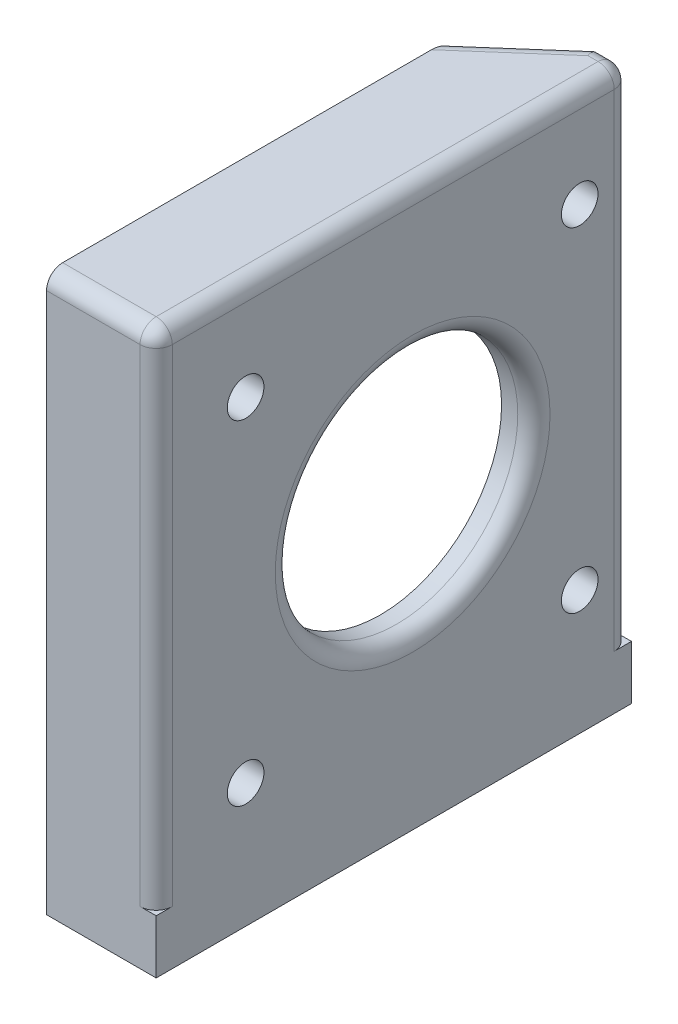
ISO-10303-21;
HEADER;
FILE_DESCRIPTION(('STEP AP214'),'2;1');
FILE_NAME('part.step','',(''),(''),'','','');
FILE_SCHEMA(('AUTOMOTIVE_DESIGN { 1 0 10303 214 1 1 1 1 }'));
ENDSEC;
DATA;
#1=APPLICATION_CONTEXT('core data for automotive mechanical design processes');
#2=APPLICATION_PROTOCOL_DEFINITION('international standard','automotive_design',2000,#1);
#3=PRODUCT_CONTEXT('',#1,'mechanical');
#4=PRODUCT('Part','Part','',(#3));
#5=PRODUCT_RELATED_PRODUCT_CATEGORY('part','',(#4));
#6=PRODUCT_DEFINITION_FORMATION('','',#4);
#7=PRODUCT_DEFINITION_CONTEXT('part definition',#1,'design');
#8=PRODUCT_DEFINITION('design','',#6,#7);
#9=PRODUCT_DEFINITION_SHAPE('','',#8);
#10=(LENGTH_UNIT() NAMED_UNIT(*) SI_UNIT(.MILLI.,.METRE.));
#11=(NAMED_UNIT(*) PLANE_ANGLE_UNIT() SI_UNIT($,.RADIAN.));
#12=(NAMED_UNIT(*) SI_UNIT($,.STERADIAN.) SOLID_ANGLE_UNIT());
#13=UNCERTAINTY_MEASURE_WITH_UNIT(LENGTH_MEASURE(1.E-05),#10,'distance_accuracy_value','');
#14=(GEOMETRIC_REPRESENTATION_CONTEXT(3) GLOBAL_UNCERTAINTY_ASSIGNED_CONTEXT((#13)) GLOBAL_UNIT_ASSIGNED_CONTEXT((#10,
#11,#12)) REPRESENTATION_CONTEXT('',''));
#15=CARTESIAN_POINT('',(0.,0.,0.));
#16=DIRECTION('',(0.,0.,1.));
#17=DIRECTION('',(1.,0.,0.));
#18=AXIS2_PLACEMENT_3D('',#15,#16,#17);
#19=CARTESIAN_POINT('',(0.,5.,0.));
#20=DIRECTION('',(0.,1.,0.));
#21=DIRECTION('',(0.,0.,1.));
#22=AXIS2_PLACEMENT_3D('',#19,#20,#21);
#23=PLANE('',#22);
#24=DIRECTION('',(-1.,0.,0.));
#25=VECTOR('',#24,1.);
#26=CARTESIAN_POINT('',(0.,5.,266.464902660625));
#27=LINE('',#26,#25);
#28=CARTESIAN_POINT('',(104.746286717569,5.,266.464902660625));
#29=VERTEX_POINT('',#28);
#30=CARTESIAN_POINT('',(103.249286717569,5.,266.464902660625));
#31=VERTEX_POINT('',#30);
#32=EDGE_CURVE('E533',#29,#31,#27,.T.);
#33=ORIENTED_EDGE('',*,*,#32,.F.);
#34=DIRECTION('',(0.,0.,-1.));
#35=VECTOR('',#34,1.);
#36=CARTESIAN_POINT('',(104.746286717569,5.,0.));
#37=LINE('',#36,#35);
#38=CARTESIAN_POINT('',(104.746286717569,5.,264.967902660625));
#39=VERTEX_POINT('',#38);
#40=EDGE_CURVE('E706',#29,#39,#37,.T.);
#41=ORIENTED_EDGE('',*,*,#40,.T.);
#42=CARTESIAN_POINT('',(103.249286717569,5.,264.967902660625));
#43=DIRECTION('',(0.,1.,0.));
#44=DIRECTION('',(0.,0.,1.));
#45=AXIS2_PLACEMENT_3D('',#42,#43,#44);
#46=CIRCLE('',#45,1.497);
#47=EDGE_CURVE('E574',#39,#31,#46,.F.);
#48=ORIENTED_EDGE('',*,*,#47,.T.);
#49=EDGE_LOOP('',(#33,#41,#48));
#50=FACE_BOUND('',#49,.T.);
#51=ADVANCED_FACE('F403',(#50),#23,.T.);
#52=DIRECTION('',(-1.,0.,0.));
#53=VECTOR('',#52,1.);
#54=CARTESIAN_POINT('',(0.,5.,222.360700602375));
#55=LINE('',#54,#53);
#56=CARTESIAN_POINT('',(104.746286717569,5.,222.360700602375));
#57=VERTEX_POINT('',#56);
#58=CARTESIAN_POINT('',(94.5719030393506,5.,222.360700602375));
#59=VERTEX_POINT('',#58);
#60=EDGE_CURVE('E582',#57,#59,#55,.T.);
#61=ORIENTED_EDGE('',*,*,#60,.T.);
#62=DIRECTION('',(0.,0.,1.));
#63=VECTOR('',#62,1.);
#64=CARTESIAN_POINT('',(94.5719030393506,5.,0.));
#65=LINE('',#64,#63);
#66=CARTESIAN_POINT('',(94.5719030393506,5.,263.664902660625));
#67=VERTEX_POINT('',#66);
#68=EDGE_CURVE('E658',#59,#67,#65,.T.);
#69=ORIENTED_EDGE('',*,*,#68,.T.);
#70=DIRECTION('',(-1.,0.,0.));
#71=VECTOR('',#70,1.);
#72=CARTESIAN_POINT('',(101.746286717569,5.,263.664902660625));
#73=LINE('',#72,#71);
#74=CARTESIAN_POINT('',(101.746286717569,5.,263.664902660625));
#75=VERTEX_POINT('',#74);
#76=EDGE_CURVE('E539',#75,#67,#73,.T.);
#77=ORIENTED_EDGE('',*,*,#76,.F.);
#78=DIRECTION('',(0.,0.,1.));
#79=VECTOR('',#78,1.);
#80=CARTESIAN_POINT('',(101.746286717569,5.,222.264902660625));
#81=LINE('',#80,#79);
#82=CARTESIAN_POINT('',(101.746286717569,5.00000000000002,222.464902660625));
#83=VERTEX_POINT('',#82);
#84=EDGE_CURVE('E639',#83,#75,#81,.T.);
#85=ORIENTED_EDGE('',*,*,#84,.F.);
#86=DIRECTION('',(1.,0.,0.));
#87=VECTOR('',#86,1.);
#88=CARTESIAN_POINT('',(101.746286717569,5.00000000000002,222.464902660625));
#89=LINE('',#88,#87);
#90=CARTESIAN_POINT('',(103.249286717569,5.00000000000002,222.464902660625));
#91=VERTEX_POINT('',#90);
#92=EDGE_CURVE('E626',#83,#91,#89,.T.);
#93=ORIENTED_EDGE('',*,*,#92,.T.);
#94=CARTESIAN_POINT('',(103.249286717569,5.,223.961902660625));
#95=DIRECTION('',(0.,1.,0.));
#96=DIRECTION('',(0.,0.,1.));
#97=AXIS2_PLACEMENT_3D('',#94,#95,#96);
#98=CIRCLE('',#97,1.497);
#99=CARTESIAN_POINT('',(104.746286717569,5.00000000000001,223.961902660625));
#100=VERTEX_POINT('',#99);
#101=EDGE_CURVE('E411',#91,#100,#98,.F.);
#102=ORIENTED_EDGE('',*,*,#101,.T.);
#103=EDGE_CURVE('E704',#100,#57,#37,.T.);
#104=ORIENTED_EDGE('',*,*,#103,.T.);
#105=EDGE_LOOP('',(#61,#69,#77,#85,#93,#102,#104));
#106=FACE_BOUND('',#105,.T.);
#107=ADVANCED_FACE('F657',(#106),#23,.T.);
#108=CARTESIAN_POINT('',(0.,5.,266.464902660625));
#109=DIRECTION('',(0.,0.,1.));
#110=DIRECTION('',(1.,0.,0.));
#111=AXIS2_PLACEMENT_3D('',#108,#109,#110);
#112=PLANE('',#111);
#113=DIRECTION('',(-1.,0.,0.));
#114=VECTOR('',#113,1.);
#115=CARTESIAN_POINT('',(0.,50.153,266.464902660625));
#116=LINE('',#115,#114);
#117=CARTESIAN_POINT('',(103.249286717569,50.153,266.464902660625));
#118=VERTEX_POINT('',#117);
#119=CARTESIAN_POINT('',(94.5719030393506,50.153,266.464902660625));
#120=VERTEX_POINT('',#119);
#121=EDGE_CURVE('E526',#118,#120,#116,.T.);
#122=ORIENTED_EDGE('',*,*,#121,.T.);
#123=DIRECTION('',(0.,1.,0.));
#124=VECTOR('',#123,1.);
#125=CARTESIAN_POINT('',(94.5719030393506,0.,266.464902660625));
#126=LINE('',#125,#124);
#127=CARTESIAN_POINT('',(94.5719030393506,0.,266.464902660625));
#128=VERTEX_POINT('',#127);
#129=EDGE_CURVE('E418',#128,#120,#126,.T.);
#130=ORIENTED_EDGE('',*,*,#129,.F.);
#131=DIRECTION('',(-1.,0.,0.));
#132=VECTOR('',#131,1.);
#133=CARTESIAN_POINT('',(0.,0.,266.464902660625));
#134=LINE('',#133,#132);
#135=CARTESIAN_POINT('',(104.746286717569,0.,266.464902660625));
#136=VERTEX_POINT('',#135);
#137=EDGE_CURVE('E524',#136,#128,#134,.T.);
#138=ORIENTED_EDGE('',*,*,#137,.F.);
#139=DIRECTION('',(0.,1.,0.));
#140=VECTOR('',#139,1.);
#141=CARTESIAN_POINT('',(104.746286717569,0.,266.464902660625));
#142=LINE('',#141,#140);
#143=EDGE_CURVE('E527',#136,#29,#142,.T.);
#144=ORIENTED_EDGE('',*,*,#143,.T.);
#145=ORIENTED_EDGE('',*,*,#32,.T.);
#146=DIRECTION('',(0.,1.,0.));
#147=VECTOR('',#146,1.);
#148=CARTESIAN_POINT('',(103.249286717569,5.,266.464902660625));
#149=LINE('',#148,#147);
#150=EDGE_CURVE('E563',#31,#118,#149,.T.);
#151=ORIENTED_EDGE('',*,*,#150,.T.);
#152=EDGE_LOOP('',(#122,#130,#138,#144,#145,#151));
#153=FACE_BOUND('',#152,.T.);
#154=ADVANCED_FACE('F522',(#153),#112,.T.);
#155=CARTESIAN_POINT('',(0.,0.,0.));
#156=DIRECTION('',(0.,1.,0.));
#157=DIRECTION('',(0.,0.,1.));
#158=AXIS2_PLACEMENT_3D('',#155,#156,#157);
#159=PLANE('',#158);
#160=DIRECTION('',(0.,0.,1.));
#161=VECTOR('',#160,1.);
#162=CARTESIAN_POINT('',(94.5719030393506,0.,266.464902660625));
#163=LINE('',#162,#161);
#164=CARTESIAN_POINT('',(94.5719030393506,0.,222.360700602375));
#165=VERTEX_POINT('',#164);
#166=EDGE_CURVE('E508',#165,#128,#163,.T.);
#167=ORIENTED_EDGE('',*,*,#166,.F.);
#168=DIRECTION('',(-1.,0.,0.));
#169=VECTOR('',#168,1.);
#170=CARTESIAN_POINT('',(94.5719030393506,0.,222.360700602375));
#171=LINE('',#170,#169);
#172=CARTESIAN_POINT('',(104.746286717569,0.,222.360700602375));
#173=VERTEX_POINT('',#172);
#174=EDGE_CURVE('E528',#173,#165,#171,.T.);
#175=ORIENTED_EDGE('',*,*,#174,.F.);
#176=DIRECTION('',(0.,0.,-1.));
#177=VECTOR('',#176,1.);
#178=CARTESIAN_POINT('',(104.746286717569,0.,266.464902660625));
#179=LINE('',#178,#177);
#180=EDGE_CURVE('E516',#136,#173,#179,.T.);
#181=ORIENTED_EDGE('',*,*,#180,.F.);
#182=ORIENTED_EDGE('',*,*,#137,.T.);
#183=EDGE_LOOP('',(#167,#175,#181,#182));
#184=FACE_BOUND('',#183,.T.);
#185=ADVANCED_FACE('F531',(#184),#159,.F.);
#186=CARTESIAN_POINT('',(104.746286717569,51.65,219.464902660625));
#187=DIRECTION('',(0.,1.,0.));
#188=DIRECTION('',(-1.,0.,0.));
#189=AXIS2_PLACEMENT_3D('',#186,#187,#188);
#190=PLANE('',#189);
#191=DIRECTION('',(0.751981712027143,0.,-0.659183968840814));
#192=VECTOR('',#191,1.);
#193=CARTESIAN_POINT('',(55.7330851189234,51.65,264.790619283529));
#194=LINE('',#193,#192);
#195=CARTESIAN_POINT('',(102.309533693596,51.65,223.961902660625));
#196=VERTEX_POINT('',#195);
#197=CARTESIAN_POINT('',(94.5719030393506,51.65,230.744676766049));
#198=VERTEX_POINT('',#197);
#199=EDGE_CURVE('E555',#196,#198,#194,.F.);
#200=ORIENTED_EDGE('',*,*,#199,.T.);
#201=DIRECTION('',(0.,0.,1.));
#202=VECTOR('',#201,1.);
#203=CARTESIAN_POINT('',(94.5719030393506,51.65,266.464902660625));
#204=LINE('',#203,#202);
#205=CARTESIAN_POINT('',(94.5719030393506,51.65,264.967902660625));
#206=VERTEX_POINT('',#205);
#207=EDGE_CURVE('E517',#198,#206,#204,.T.);
#208=ORIENTED_EDGE('',*,*,#207,.T.);
#209=DIRECTION('',(-1.,0.,0.));
#210=VECTOR('',#209,1.);
#211=CARTESIAN_POINT('',(104.746286717569,51.65,264.967902660625));
#212=LINE('',#211,#210);
#213=CARTESIAN_POINT('',(103.249286717569,51.65,264.967902660625));
#214=VERTEX_POINT('',#213);
#215=EDGE_CURVE('E558',#206,#214,#212,.F.);
#216=ORIENTED_EDGE('',*,*,#215,.T.);
#217=DIRECTION('',(0.,0.,1.));
#218=VECTOR('',#217,1.);
#219=CARTESIAN_POINT('',(103.249286717569,51.65,219.464902660625));
#220=LINE('',#219,#218);
#221=CARTESIAN_POINT('',(103.249286717569,51.65,223.961902660625));
#222=VERTEX_POINT('',#221);
#223=EDGE_CURVE('E560',#214,#222,#220,.F.);
#224=ORIENTED_EDGE('',*,*,#223,.T.);
#225=DIRECTION('',(1.,0.,0.));
#226=VECTOR('',#225,1.);
#227=CARTESIAN_POINT('',(101.746286717569,51.65,223.961902660625));
#228=LINE('',#227,#226);
#229=EDGE_CURVE('E553',#222,#196,#228,.F.);
#230=ORIENTED_EDGE('',*,*,#229,.T.);
#231=EDGE_LOOP('',(#200,#208,#216,#224,#230));
#232=FACE_BOUND('',#231,.T.);
#233=ADVANCED_FACE('F719',(#232),#190,.T.);
#234=CARTESIAN_POINT('',(101.746286717569,49.05,222.264902660625));
#235=DIRECTION('',(0.,-1.,0.));
#236=DIRECTION('',(0.,0.,-1.));
#237=AXIS2_PLACEMENT_3D('',#234,#235,#236);
#238=PLANE('',#237);
#239=DIRECTION('',(-1.,0.,0.));
#240=VECTOR('',#239,1.);
#241=CARTESIAN_POINT('',(101.746286717569,49.05,263.664902660625));
#242=LINE('',#241,#240);
#243=CARTESIAN_POINT('',(101.746286717569,49.05,263.664902660625));
#244=VERTEX_POINT('',#243);
#245=CARTESIAN_POINT('',(94.5719030393506,49.05,263.664902660625));
#246=VERTEX_POINT('',#245);
#247=EDGE_CURVE('E534',#244,#246,#242,.T.);
#248=ORIENTED_EDGE('',*,*,#247,.T.);
#249=DIRECTION('',(0.,0.,-1.));
#250=VECTOR('',#249,1.);
#251=CARTESIAN_POINT('',(94.5719030393506,49.05,222.264902660625));
#252=LINE('',#251,#250);
#253=CARTESIAN_POINT('',(94.5719030393506,49.05,228.753936863659));
#254=VERTEX_POINT('',#253);
#255=EDGE_CURVE('E662',#246,#254,#252,.T.);
#256=ORIENTED_EDGE('',*,*,#255,.T.);
#257=DIRECTION('',(-0.751981712027143,0.,0.659183968840814));
#258=VECTOR('',#257,1.);
#259=CARTESIAN_POINT('',(101.845425575455,49.05,222.37799795967));
#260=LINE('',#259,#258);
#261=CARTESIAN_POINT('',(101.746286717569,49.05,222.464902660625));
#262=VERTEX_POINT('',#261);
#263=EDGE_CURVE('E633',#262,#254,#260,.T.);
#264=ORIENTED_EDGE('',*,*,#263,.F.);
#265=DIRECTION('',(0.,0.,1.));
#266=VECTOR('',#265,1.);
#267=CARTESIAN_POINT('',(101.746286717569,49.05,222.264902660625));
#268=LINE('',#267,#266);
#269=EDGE_CURVE('E644',#262,#244,#268,.T.);
#270=ORIENTED_EDGE('',*,*,#269,.T.);
#271=EDGE_LOOP('',(#248,#256,#264,#270));
#272=FACE_BOUND('',#271,.T.);
#273=ADVANCED_FACE('F685',(#272),#238,.T.);
#274=CARTESIAN_POINT('',(101.746286717569,49.05,263.664902660625));
#275=DIRECTION('',(0.,0.,-1.));
#276=DIRECTION('',(-1.,0.,0.));
#277=AXIS2_PLACEMENT_3D('',#274,#275,#276);
#278=PLANE('',#277);
#279=ORIENTED_EDGE('',*,*,#76,.T.);
#280=DIRECTION('',(0.,1.,0.));
#281=VECTOR('',#280,1.);
#282=CARTESIAN_POINT('',(94.5719030393506,49.05,263.664902660625));
#283=LINE('',#282,#281);
#284=EDGE_CURVE('E651',#67,#246,#283,.T.);
#285=ORIENTED_EDGE('',*,*,#284,.T.);
#286=ORIENTED_EDGE('',*,*,#247,.F.);
#287=DIRECTION('',(0.,-1.,0.));
#288=VECTOR('',#287,1.);
#289=CARTESIAN_POINT('',(101.746286717569,49.05,263.664902660625));
#290=LINE('',#289,#288);
#291=EDGE_CURVE('E641',#244,#75,#290,.T.);
#292=ORIENTED_EDGE('',*,*,#291,.T.);
#293=EDGE_LOOP('',(#279,#285,#286,#292));
#294=FACE_BOUND('',#293,.T.);
#295=ADVANCED_FACE('F649',(#294),#278,.T.);
#296=CARTESIAN_POINT('',(54.7462867175687,5.,263.664902660625));
#297=DIRECTION('',(0.659183968840814,0.,0.751981712027143));
#298=DIRECTION('',(0.751981712027143,0.,-0.659183968840814));
#299=AXIS2_PLACEMENT_3D('',#296,#297,#298);
#300=PLANE('',#299);
#301=DIRECTION('',(0.,-1.,0.));
#302=VECTOR('',#301,1.);
#303=CARTESIAN_POINT('',(94.5719030393506,5.,228.753936863659));
#304=LINE('',#303,#302);
#305=CARTESIAN_POINT('',(94.5719030393506,50.153,228.753936863659));
#306=VERTEX_POINT('',#305);
#307=EDGE_CURVE('E690',#306,#254,#304,.T.);
#308=ORIENTED_EDGE('',*,*,#307,.F.);
#309=DIRECTION('',(0.751981712027143,0.,-0.659183968840814));
#310=VECTOR('',#309,1.);
#311=CARTESIAN_POINT('',(101.746286717569,50.153,222.464902660625));
#312=LINE('',#311,#310);
#313=CARTESIAN_POINT('',(101.746286717569,50.153,222.464902660625));
#314=VERTEX_POINT('',#313);
#315=EDGE_CURVE('E566',#306,#314,#312,.T.);
#316=ORIENTED_EDGE('',*,*,#315,.T.);
#317=DIRECTION('',(0.,1.,0.));
#318=VECTOR('',#317,1.);
#319=CARTESIAN_POINT('',(101.746286717569,5.00000000000002,222.464902660625));
#320=LINE('',#319,#318);
#321=EDGE_CURVE('E629',#262,#314,#320,.T.);
#322=ORIENTED_EDGE('',*,*,#321,.F.);
#323=ORIENTED_EDGE('',*,*,#263,.T.);
#324=EDGE_LOOP('',(#308,#316,#322,#323));
#325=FACE_BOUND('',#324,.T.);
#326=ADVANCED_FACE('F689',(#325),#300,.F.);
#327=CARTESIAN_POINT('',(55.7330851189234,50.153,264.790619283529));
#328=DIRECTION('',(-0.751981712027143,0.,0.659183968840814));
#329=DIRECTION('',(0.659183968840814,0.,0.751981712027143));
#330=AXIS2_PLACEMENT_3D('',#327,#328,#329);
#331=CYLINDRICAL_SURFACE('',#330,1.497);
#332=ORIENTED_EDGE('',*,*,#315,.F.);
#333=CARTESIAN_POINT('',(94.5719030393506,50.153,230.744676766049));
#334=DIRECTION('',(-1.,0.,0.));
#335=DIRECTION('',(0.,0.,1.));
#336=AXIS2_PLACEMENT_3D('',#333,#334,#335);
#337=ELLIPSE('',#336,1.99073990239003,1.497);
#338=EDGE_CURVE('E708',#306,#198,#337,.F.);
#339=ORIENTED_EDGE('',*,*,#338,.T.);
#340=ORIENTED_EDGE('',*,*,#199,.F.);
#341=CARTESIAN_POINT('',(102.309533693596,50.153,223.961902660625));
#342=DIRECTION('',(-0.935943831655282,0.,0.352149320582091));
#343=DIRECTION('',(-0.352149320582091,0.,-0.935943831655282));
#344=AXIS2_PLACEMENT_3D('',#341,#342,#343);
#345=ELLIPSE('',#344,1.59945495591594,1.497);
#346=EDGE_CURVE('E595',#314,#196,#345,.F.);
#347=ORIENTED_EDGE('',*,*,#346,.F.);
#348=EDGE_LOOP('',(#332,#339,#340,#347));
#349=FACE_BOUND('',#348,.T.);
#350=ADVANCED_FACE('F717',(#349),#331,.T.);
#351=CARTESIAN_POINT('',(0.,50.153,264.967902660625));
#352=DIRECTION('',(-1.,0.,0.));
#353=DIRECTION('',(0.,-1.,0.));
#354=AXIS2_PLACEMENT_3D('',#351,#352,#353);
#355=CYLINDRICAL_SURFACE('',#354,1.497);
#356=ORIENTED_EDGE('',*,*,#215,.F.);
#357=CARTESIAN_POINT('',(94.5719030393506,50.153,264.967902660625));
#358=DIRECTION('',(-1.,0.,0.));
#359=DIRECTION('',(0.,-1.,0.));
#360=AXIS2_PLACEMENT_3D('',#357,#358,#359);
#361=CIRCLE('',#360,1.497);
#362=EDGE_CURVE('E13',#206,#120,#361,.F.);
#363=ORIENTED_EDGE('',*,*,#362,.T.);
#364=ORIENTED_EDGE('',*,*,#121,.F.);
#365=CARTESIAN_POINT('',(103.249286717569,50.153,264.967902660625));
#366=DIRECTION('',(1.,0.,0.));
#367=DIRECTION('',(0.,0.,-1.));
#368=AXIS2_PLACEMENT_3D('',#365,#366,#367);
#369=CIRCLE('',#368,1.497);
#370=EDGE_CURVE('E584',#214,#118,#369,.T.);
#371=ORIENTED_EDGE('',*,*,#370,.F.);
#372=EDGE_LOOP('',(#356,#363,#364,#371));
#373=FACE_BOUND('',#372,.T.);
#374=ADVANCED_FACE('F740',(#373),#355,.T.);
#375=CARTESIAN_POINT('',(104.746286717569,5.,219.464902660625));
#376=DIRECTION('',(1.,0.,0.));
#377=DIRECTION('',(0.,0.,-1.));
#378=AXIS2_PLACEMENT_3D('',#375,#376,#377);
#379=PLANE('',#378);
#380=DIRECTION('',(0.,1.,0.));
#381=VECTOR('',#380,1.);
#382=CARTESIAN_POINT('',(104.746286717569,5.,264.967902660625));
#383=LINE('',#382,#381);
#384=CARTESIAN_POINT('',(104.746286717569,50.153,264.967902660625));
#385=VERTEX_POINT('',#384);
#386=EDGE_CURVE('E547',#385,#39,#383,.F.);
#387=ORIENTED_EDGE('',*,*,#386,.T.);
#388=ORIENTED_EDGE('',*,*,#40,.F.);
#389=ORIENTED_EDGE('',*,*,#143,.F.);
#390=ORIENTED_EDGE('',*,*,#180,.T.);
#391=DIRECTION('',(0.,1.,0.));
#392=VECTOR('',#391,1.);
#393=CARTESIAN_POINT('',(104.746286717569,0.,222.360700602375));
#394=LINE('',#393,#392);
#395=EDGE_CURVE('E705',#173,#57,#394,.T.);
#396=ORIENTED_EDGE('',*,*,#395,.T.);
#397=ORIENTED_EDGE('',*,*,#103,.F.);
#398=DIRECTION('',(0.,1.,0.));
#399=VECTOR('',#398,1.);
#400=CARTESIAN_POINT('',(104.746286717569,51.65,223.961902660625));
#401=LINE('',#400,#399);
#402=CARTESIAN_POINT('',(104.746286717569,50.153,223.961902660625));
#403=VERTEX_POINT('',#402);
#404=EDGE_CURVE('E536',#100,#403,#401,.T.);
#405=ORIENTED_EDGE('',*,*,#404,.T.);
#406=DIRECTION('',(0.,0.,1.));
#407=VECTOR('',#406,1.);
#408=CARTESIAN_POINT('',(104.746286717569,50.153,219.464902660625));
#409=LINE('',#408,#407);
#410=EDGE_CURVE('E544',#403,#385,#409,.T.);
#411=ORIENTED_EDGE('',*,*,#410,.T.);
#412=EDGE_LOOP('',(#387,#388,#389,#390,#396,#397,#405,#411));
#413=FACE_BOUND('',#412,.T.);
#414=CARTESIAN_POINT('',(104.746286717569,27.025,242.664902660625));
#415=DIRECTION('',(1.,0.,0.));
#416=DIRECTION('',(0.,0.,-1.));
#417=AXIS2_PLACEMENT_3D('',#414,#415,#416);
#418=CIRCLE('',#417,12.747);
#419=CARTESIAN_POINT('',(104.746286717569,27.025,229.917902660625));
#420=VERTEX_POINT('',#419);
#421=EDGE_CURVE('E550',#420,#420,#418,.F.);
#422=ORIENTED_EDGE('',*,*,#421,.T.);
#423=EDGE_LOOP('',(#422));
#424=FACE_BOUND('',#423,.T.);
#425=CARTESIAN_POINT('',(104.746286717569,11.525,227.164902660625));
#426=DIRECTION('',(1.,0.,0.));
#427=DIRECTION('',(0.,0.,-1.));
#428=AXIS2_PLACEMENT_3D('',#425,#426,#427);
#429=CIRCLE('',#428,1.70000000000001);
#430=CARTESIAN_POINT('',(104.746286717569,11.525,225.464902660625));
#431=VERTEX_POINT('',#430);
#432=EDGE_CURVE('E623',#431,#431,#429,.T.);
#433=ORIENTED_EDGE('',*,*,#432,.F.);
#434=EDGE_LOOP('',(#433));
#435=FACE_BOUND('',#434,.T.);
#436=CARTESIAN_POINT('',(104.746286717569,11.525,258.164902660625));
#437=DIRECTION('',(1.,0.,0.));
#438=DIRECTION('',(0.,0.,-1.));
#439=AXIS2_PLACEMENT_3D('',#436,#437,#438);
#440=CIRCLE('',#439,1.69999999999996);
#441=CARTESIAN_POINT('',(104.746286717569,11.525,256.464902660625));
#442=VERTEX_POINT('',#441);
#443=EDGE_CURVE('E620',#442,#442,#440,.T.);
#444=ORIENTED_EDGE('',*,*,#443,.F.);
#445=EDGE_LOOP('',(#444));
#446=FACE_BOUND('',#445,.T.);
#447=CARTESIAN_POINT('',(104.746286717569,42.525,258.164902660625));
#448=DIRECTION('',(1.,0.,0.));
#449=DIRECTION('',(0.,0.,-1.));
#450=AXIS2_PLACEMENT_3D('',#447,#448,#449);
#451=CIRCLE('',#450,1.69999999999996);
#452=CARTESIAN_POINT('',(104.746286717569,42.525,256.464902660625));
#453=VERTEX_POINT('',#452);
#454=EDGE_CURVE('E617',#453,#453,#451,.T.);
#455=ORIENTED_EDGE('',*,*,#454,.F.);
#456=EDGE_LOOP('',(#455));
#457=FACE_BOUND('',#456,.T.);
#458=CARTESIAN_POINT('',(104.746286717569,42.525,227.164902660625));
#459=DIRECTION('',(1.,0.,0.));
#460=DIRECTION('',(0.,0.,-1.));
#461=AXIS2_PLACEMENT_3D('',#458,#459,#460);
#462=CIRCLE('',#461,1.70000000000001);
#463=CARTESIAN_POINT('',(104.746286717569,42.525,225.464902660625));
#464=VERTEX_POINT('',#463);
#465=EDGE_CURVE('E614',#464,#464,#462,.T.);
#466=ORIENTED_EDGE('',*,*,#465,.F.);
#467=EDGE_LOOP('',(#466));
#468=FACE_BOUND('',#467,.T.);
#469=ADVANCED_FACE('F674',(#413,#424,#435,#446,#457,#468),#379,.T.);
#470=CARTESIAN_POINT('',(101.746286717569,0.,0.));
#471=DIRECTION('',(1.,0.,0.));
#472=DIRECTION('',(0.,0.,-1.));
#473=AXIS2_PLACEMENT_3D('',#470,#471,#472);
#474=PLANE('',#473);
#475=CARTESIAN_POINT('',(101.746286717569,11.525,227.164902660625));
#476=DIRECTION('',(-1.,0.,0.));
#477=DIRECTION('',(0.,0.,1.));
#478=AXIS2_PLACEMENT_3D('',#475,#476,#477);
#479=CIRCLE('',#478,1.70000000000001);
#480=CARTESIAN_POINT('',(101.746286717569,11.525,228.864902660625));
#481=VERTEX_POINT('',#480);
#482=EDGE_CURVE('E597',#481,#481,#479,.T.);
#483=ORIENTED_EDGE('',*,*,#482,.F.);
#484=EDGE_LOOP('',(#483));
#485=FACE_BOUND('',#484,.T.);
#486=CARTESIAN_POINT('',(101.746286717569,11.525,258.164902660625));
#487=DIRECTION('',(-1.,0.,0.));
#488=DIRECTION('',(0.,0.,1.));
#489=AXIS2_PLACEMENT_3D('',#486,#487,#488);
#490=CIRCLE('',#489,1.69999999999996);
#491=CARTESIAN_POINT('',(101.746286717569,11.525,259.864902660625));
#492=VERTEX_POINT('',#491);
#493=EDGE_CURVE('E602',#492,#492,#490,.T.);
#494=ORIENTED_EDGE('',*,*,#493,.F.);
#495=EDGE_LOOP('',(#494));
#496=FACE_BOUND('',#495,.T.);
#497=CARTESIAN_POINT('',(101.746286717569,42.525,258.164902660625));
#498=DIRECTION('',(-1.,0.,0.));
#499=DIRECTION('',(0.,0.,1.));
#500=AXIS2_PLACEMENT_3D('',#497,#498,#499);
#501=CIRCLE('',#500,1.69999999999996);
#502=CARTESIAN_POINT('',(101.746286717569,42.525,259.864902660625));
#503=VERTEX_POINT('',#502);
#504=EDGE_CURVE('E607',#503,#503,#501,.T.);
#505=ORIENTED_EDGE('',*,*,#504,.F.);
#506=EDGE_LOOP('',(#505));
#507=FACE_BOUND('',#506,.T.);
#508=CARTESIAN_POINT('',(101.746286717569,42.525,227.164902660625));
#509=DIRECTION('',(-1.,0.,0.));
#510=DIRECTION('',(0.,0.,1.));
#511=AXIS2_PLACEMENT_3D('',#508,#509,#510);
#512=CIRCLE('',#511,1.70000000000001);
#513=CARTESIAN_POINT('',(101.746286717569,42.525,228.864902660625));
#514=VERTEX_POINT('',#513);
#515=EDGE_CURVE('E611',#514,#514,#512,.T.);
#516=ORIENTED_EDGE('',*,*,#515,.F.);
#517=EDGE_LOOP('',(#516));
#518=FACE_BOUND('',#517,.T.);
#519=CARTESIAN_POINT('',(101.746286717569,27.025,242.664902660625));
#520=DIRECTION('',(-1.,0.,0.));
#521=DIRECTION('',(0.,0.,1.));
#522=AXIS2_PLACEMENT_3D('',#519,#520,#521);
#523=CIRCLE('',#522,11.25);
#524=CARTESIAN_POINT('',(101.746286717569,27.025,253.914902660625));
#525=VERTEX_POINT('',#524);
#526=EDGE_CURVE('E636',#525,#525,#523,.T.);
#527=ORIENTED_EDGE('',*,*,#526,.F.);
#528=EDGE_LOOP('',(#527));
#529=FACE_BOUND('',#528,.T.);
#530=ORIENTED_EDGE('',*,*,#269,.F.);
#531=EDGE_CURVE('E630',#83,#262,#320,.T.);
#532=ORIENTED_EDGE('',*,*,#531,.F.);
#533=ORIENTED_EDGE('',*,*,#84,.T.);
#534=ORIENTED_EDGE('',*,*,#291,.F.);
#535=EDGE_LOOP('',(#530,#532,#533,#534));
#536=FACE_BOUND('',#535,.T.);
#537=ADVANCED_FACE('F670',(#485,#496,#507,#518,#529,#536),#474,.F.);
#538=CARTESIAN_POINT('',(208.746286717569,27.025,242.664902660625));
#539=DIRECTION('',(-1.,0.,0.));
#540=DIRECTION('',(0.,0.,1.));
#541=AXIS2_PLACEMENT_3D('',#538,#539,#540);
#542=CYLINDRICAL_SURFACE('',#541,11.25);
#543=CARTESIAN_POINT('',(103.249286717569,27.025,242.664902660625));
#544=DIRECTION('',(1.,0.,0.));
#545=DIRECTION('',(0.,0.,-1.));
#546=AXIS2_PLACEMENT_3D('',#543,#544,#545);
#547=CIRCLE('',#546,11.25);
#548=CARTESIAN_POINT('',(103.249286717569,27.025,231.414902660625));
#549=VERTEX_POINT('',#548);
#550=EDGE_CURVE('E571',#549,#549,#547,.T.);
#551=ORIENTED_EDGE('',*,*,#550,.T.);
#552=EDGE_LOOP('',(#551));
#553=FACE_BOUND('',#552,.T.);
#554=ORIENTED_EDGE('',*,*,#526,.T.);
#555=EDGE_LOOP('',(#554));
#556=FACE_BOUND('',#555,.T.);
#557=ADVANCED_FACE('F673',(#553,#556),#542,.F.);
#558=CARTESIAN_POINT('',(101.746286717569,5.00000000000002,222.464902660625));
#559=DIRECTION('',(0.,0.,1.));
#560=DIRECTION('',(1.,0.,0.));
#561=AXIS2_PLACEMENT_3D('',#558,#559,#560);
#562=PLANE('',#561);
#563=ORIENTED_EDGE('',*,*,#321,.T.);
#564=DIRECTION('',(1.,0.,0.));
#565=VECTOR('',#564,1.);
#566=CARTESIAN_POINT('',(104.746286717569,50.153,222.464902660625));
#567=LINE('',#566,#565);
#568=CARTESIAN_POINT('',(103.249286717569,50.153,222.464902660625));
#569=VERTEX_POINT('',#568);
#570=EDGE_CURVE('E425',#314,#569,#567,.T.);
#571=ORIENTED_EDGE('',*,*,#570,.T.);
#572=DIRECTION('',(0.,1.,0.));
#573=VECTOR('',#572,1.);
#574=CARTESIAN_POINT('',(103.249286717569,5.00000000000002,222.464902660625));
#575=LINE('',#574,#573);
#576=EDGE_CURVE('E568',#569,#91,#575,.F.);
#577=ORIENTED_EDGE('',*,*,#576,.T.);
#578=ORIENTED_EDGE('',*,*,#92,.F.);
#579=ORIENTED_EDGE('',*,*,#531,.T.);
#580=EDGE_LOOP('',(#563,#571,#577,#578,#579));
#581=FACE_BOUND('',#580,.T.);
#582=ADVANCED_FACE('F692',(#581),#562,.F.);
#583=CARTESIAN_POINT('',(208.746286717569,42.525,227.164902660625));
#584=DIRECTION('',(-1.,0.,0.));
#585=DIRECTION('',(0.,0.,1.));
#586=AXIS2_PLACEMENT_3D('',#583,#584,#585);
#587=CYLINDRICAL_SURFACE('',#586,1.70000000000001);
#588=ORIENTED_EDGE('',*,*,#465,.T.);
#589=EDGE_LOOP('',(#588));
#590=FACE_BOUND('',#589,.T.);
#591=ORIENTED_EDGE('',*,*,#515,.T.);
#592=EDGE_LOOP('',(#591));
#593=FACE_BOUND('',#592,.T.);
#594=ADVANCED_FACE('F792',(#590,#593),#587,.F.);
#595=CARTESIAN_POINT('',(208.746286717569,42.525,258.164902660625));
#596=DIRECTION('',(-1.,0.,0.));
#597=DIRECTION('',(0.,0.,1.));
#598=AXIS2_PLACEMENT_3D('',#595,#596,#597);
#599=CYLINDRICAL_SURFACE('',#598,1.69999999999996);
#600=ORIENTED_EDGE('',*,*,#454,.T.);
#601=EDGE_LOOP('',(#600));
#602=FACE_BOUND('',#601,.T.);
#603=ORIENTED_EDGE('',*,*,#504,.T.);
#604=EDGE_LOOP('',(#603));
#605=FACE_BOUND('',#604,.T.);
#606=ADVANCED_FACE('F668',(#602,#605),#599,.F.);
#607=CARTESIAN_POINT('',(208.746286717569,11.525,258.164902660625));
#608=DIRECTION('',(-1.,0.,0.));
#609=DIRECTION('',(0.,0.,1.));
#610=AXIS2_PLACEMENT_3D('',#607,#608,#609);
#611=CYLINDRICAL_SURFACE('',#610,1.69999999999996);
#612=ORIENTED_EDGE('',*,*,#443,.T.);
#613=EDGE_LOOP('',(#612));
#614=FACE_BOUND('',#613,.T.);
#615=ORIENTED_EDGE('',*,*,#493,.T.);
#616=EDGE_LOOP('',(#615));
#617=FACE_BOUND('',#616,.T.);
#618=ADVANCED_FACE('F781',(#614,#617),#611,.F.);
#619=CARTESIAN_POINT('',(208.746286717569,11.525,227.164902660625));
#620=DIRECTION('',(-1.,0.,0.));
#621=DIRECTION('',(0.,0.,1.));
#622=AXIS2_PLACEMENT_3D('',#619,#620,#621);
#623=CYLINDRICAL_SURFACE('',#622,1.70000000000001);
#624=ORIENTED_EDGE('',*,*,#432,.T.);
#625=EDGE_LOOP('',(#624));
#626=FACE_BOUND('',#625,.T.);
#627=ORIENTED_EDGE('',*,*,#482,.T.);
#628=EDGE_LOOP('',(#627));
#629=FACE_BOUND('',#628,.T.);
#630=ADVANCED_FACE('F776',(#626,#629),#623,.F.);
#631=CARTESIAN_POINT('',(101.746286717569,50.153,223.961902660625));
#632=DIRECTION('',(-1.,0.,0.));
#633=DIRECTION('',(0.,-1.,0.));
#634=AXIS2_PLACEMENT_3D('',#631,#632,#633);
#635=CYLINDRICAL_SURFACE('',#634,1.497);
#636=ORIENTED_EDGE('',*,*,#346,.T.);
#637=ORIENTED_EDGE('',*,*,#229,.F.);
#638=CARTESIAN_POINT('',(103.249286717569,50.153,223.961902660625));
#639=DIRECTION('',(1.,0.,0.));
#640=DIRECTION('',(0.,0.,-1.));
#641=AXIS2_PLACEMENT_3D('',#638,#639,#640);
#642=CIRCLE('',#641,1.497);
#643=EDGE_CURVE('E593',#569,#222,#642,.T.);
#644=ORIENTED_EDGE('',*,*,#643,.F.);
#645=ORIENTED_EDGE('',*,*,#570,.F.);
#646=EDGE_LOOP('',(#636,#637,#644,#645));
#647=FACE_BOUND('',#646,.T.);
#648=ADVANCED_FACE('F722',(#647),#635,.T.);
#649=CARTESIAN_POINT('',(103.249286717569,5.,223.961902660625));
#650=DIRECTION('',(0.,-1.,0.));
#651=DIRECTION('',(0.,0.,-1.));
#652=AXIS2_PLACEMENT_3D('',#649,#650,#651);
#653=CYLINDRICAL_SURFACE('',#652,1.497);
#654=ORIENTED_EDGE('',*,*,#101,.F.);
#655=ORIENTED_EDGE('',*,*,#576,.F.);
#656=CARTESIAN_POINT('',(103.249286717569,50.153,223.961902660625));
#657=DIRECTION('',(0.,1.,0.));
#658=DIRECTION('',(0.,0.,1.));
#659=AXIS2_PLACEMENT_3D('',#656,#657,#658);
#660=CIRCLE('',#659,1.497);
#661=EDGE_CURVE('E590',#403,#569,#660,.T.);
#662=ORIENTED_EDGE('',*,*,#661,.F.);
#663=ORIENTED_EDGE('',*,*,#404,.F.);
#664=EDGE_LOOP('',(#654,#655,#662,#663));
#665=FACE_BOUND('',#664,.T.);
#666=ADVANCED_FACE('F696',(#665),#653,.T.);
#667=CARTESIAN_POINT('',(103.249286717569,5.,264.967902660625));
#668=DIRECTION('',(0.,1.,0.));
#669=DIRECTION('',(0.,0.,1.));
#670=AXIS2_PLACEMENT_3D('',#667,#668,#669);
#671=CYLINDRICAL_SURFACE('',#670,1.497);
#672=ORIENTED_EDGE('',*,*,#47,.F.);
#673=ORIENTED_EDGE('',*,*,#386,.F.);
#674=CARTESIAN_POINT('',(103.249286717569,50.153,264.967902660625));
#675=DIRECTION('',(0.,1.,0.));
#676=DIRECTION('',(0.,0.,1.));
#677=AXIS2_PLACEMENT_3D('',#674,#675,#676);
#678=CIRCLE('',#677,1.497);
#679=EDGE_CURVE('E587',#118,#385,#678,.T.);
#680=ORIENTED_EDGE('',*,*,#679,.F.);
#681=ORIENTED_EDGE('',*,*,#150,.F.);
#682=EDGE_LOOP('',(#672,#673,#680,#681));
#683=FACE_BOUND('',#682,.T.);
#684=ADVANCED_FACE('F736',(#683),#671,.T.);
#685=CARTESIAN_POINT('',(103.249286717569,50.153,223.961902660625));
#686=DIRECTION('',(0.,0.,-1.));
#687=DIRECTION('',(-1.,0.,0.));
#688=AXIS2_PLACEMENT_3D('',#685,#686,#687);
#689=SPHERICAL_SURFACE('',#688,1.497);
#690=ORIENTED_EDGE('',*,*,#661,.T.);
#691=ORIENTED_EDGE('',*,*,#643,.T.);
#692=CARTESIAN_POINT('',(103.249286717569,50.153,223.961902660625));
#693=DIRECTION('',(0.,0.,-1.));
#694=DIRECTION('',(-1.,0.,0.));
#695=AXIS2_PLACEMENT_3D('',#692,#693,#694);
#696=CIRCLE('',#695,1.497);
#697=EDGE_CURVE('E581',#403,#222,#696,.F.);
#698=ORIENTED_EDGE('',*,*,#697,.F.);
#699=EDGE_LOOP('',(#690,#691,#698));
#700=FACE_BOUND('',#699,.T.);
#701=ADVANCED_FACE('F724',(#700),#689,.T.);
#702=CARTESIAN_POINT('',(103.249286717569,50.153,264.967902660625));
#703=DIRECTION('',(0.,0.,1.));
#704=DIRECTION('',(1.,0.,0.));
#705=AXIS2_PLACEMENT_3D('',#702,#703,#704);
#706=SPHERICAL_SURFACE('',#705,1.497);
#707=ORIENTED_EDGE('',*,*,#370,.T.);
#708=ORIENTED_EDGE('',*,*,#679,.T.);
#709=CARTESIAN_POINT('',(103.249286717569,50.153,264.967902660625));
#710=DIRECTION('',(0.,0.,1.));
#711=DIRECTION('',(1.,0.,0.));
#712=AXIS2_PLACEMENT_3D('',#709,#710,#711);
#713=CIRCLE('',#712,1.497);
#714=EDGE_CURVE('E579',#214,#385,#713,.F.);
#715=ORIENTED_EDGE('',*,*,#714,.F.);
#716=EDGE_LOOP('',(#707,#708,#715));
#717=FACE_BOUND('',#716,.T.);
#718=ADVANCED_FACE('F731',(#717),#706,.T.);
#719=CARTESIAN_POINT('',(103.249286717569,50.153,219.464902660625));
#720=DIRECTION('',(0.,0.,1.));
#721=DIRECTION('',(1.,0.,0.));
#722=AXIS2_PLACEMENT_3D('',#719,#720,#721);
#723=CYLINDRICAL_SURFACE('',#722,1.497);
#724=ORIENTED_EDGE('',*,*,#697,.T.);
#725=ORIENTED_EDGE('',*,*,#223,.F.);
#726=ORIENTED_EDGE('',*,*,#714,.T.);
#727=ORIENTED_EDGE('',*,*,#410,.F.);
#728=EDGE_LOOP('',(#724,#725,#726,#727));
#729=FACE_BOUND('',#728,.T.);
#730=ADVANCED_FACE('F726',(#729),#723,.T.);
#731=CARTESIAN_POINT('',(103.249286717569,27.025,242.664902660625));
#732=DIRECTION('',(1.,0.,0.));
#733=DIRECTION('',(0.,0.,-1.));
#734=AXIS2_PLACEMENT_3D('',#731,#732,#733);
#735=TOROIDAL_SURFACE('',#734,12.747,1.497);
#736=ORIENTED_EDGE('',*,*,#421,.F.);
#737=EDGE_LOOP('',(#736));
#738=FACE_BOUND('',#737,.T.);
#739=ORIENTED_EDGE('',*,*,#550,.F.);
#740=EDGE_LOOP('',(#739));
#741=FACE_BOUND('',#740,.T.);
#742=ADVANCED_FACE('F405',(#738,#741),#735,.T.);
#743=CARTESIAN_POINT('',(94.5719030393506,0.,266.464902660625));
#744=DIRECTION('',(-1.,0.,0.));
#745=DIRECTION('',(0.,-1.,0.));
#746=AXIS2_PLACEMENT_3D('',#743,#744,#745);
#747=PLANE('',#746);
#748=DIRECTION('',(0.,1.,0.));
#749=VECTOR('',#748,1.);
#750=CARTESIAN_POINT('',(94.5719030393506,0.,222.360700602375));
#751=LINE('',#750,#749);
#752=EDGE_CURVE('E511',#165,#59,#751,.T.);
#753=ORIENTED_EDGE('',*,*,#752,.F.);
#754=ORIENTED_EDGE('',*,*,#166,.T.);
#755=ORIENTED_EDGE('',*,*,#129,.T.);
#756=ORIENTED_EDGE('',*,*,#362,.F.);
#757=ORIENTED_EDGE('',*,*,#207,.F.);
#758=ORIENTED_EDGE('',*,*,#338,.F.);
#759=ORIENTED_EDGE('',*,*,#307,.T.);
#760=ORIENTED_EDGE('',*,*,#255,.F.);
#761=ORIENTED_EDGE('',*,*,#284,.F.);
#762=ORIENTED_EDGE('',*,*,#68,.F.);
#763=EDGE_LOOP('',(#753,#754,#755,#756,#757,#758,#759,#760,#761,#762));
#764=FACE_BOUND('',#763,.T.);
#765=ADVANCED_FACE('F509',(#764),#747,.T.);
#766=CARTESIAN_POINT('',(94.5719030393506,0.,222.360700602375));
#767=DIRECTION('',(0.,0.,-1.));
#768=DIRECTION('',(-1.,0.,0.));
#769=AXIS2_PLACEMENT_3D('',#766,#767,#768);
#770=PLANE('',#769);
#771=ORIENTED_EDGE('',*,*,#395,.F.);
#772=ORIENTED_EDGE('',*,*,#174,.T.);
#773=ORIENTED_EDGE('',*,*,#752,.T.);
#774=ORIENTED_EDGE('',*,*,#60,.F.);
#775=EDGE_LOOP('',(#771,#772,#773,#774));
#776=FACE_BOUND('',#775,.T.);
#777=ADVANCED_FACE('F914',(#776),#770,.T.);
#778=CLOSED_SHELL('',(#51,#107,#154,#185,#233,#273,#295,#326,#350,#374,#469,#537,#557,#582,#594,
#606,#618,#630,#648,#666,#684,#701,#718,#730,#742,#765,#777));
#779=MANIFOLD_SOLID_BREP('B2',#778);
#780=ADVANCED_BREP_SHAPE_REPRESENTATION('',(#18,#779),#14);
#781=SHAPE_DEFINITION_REPRESENTATION(#9,#780);
ENDSEC;
END-ISO-10303-21;
